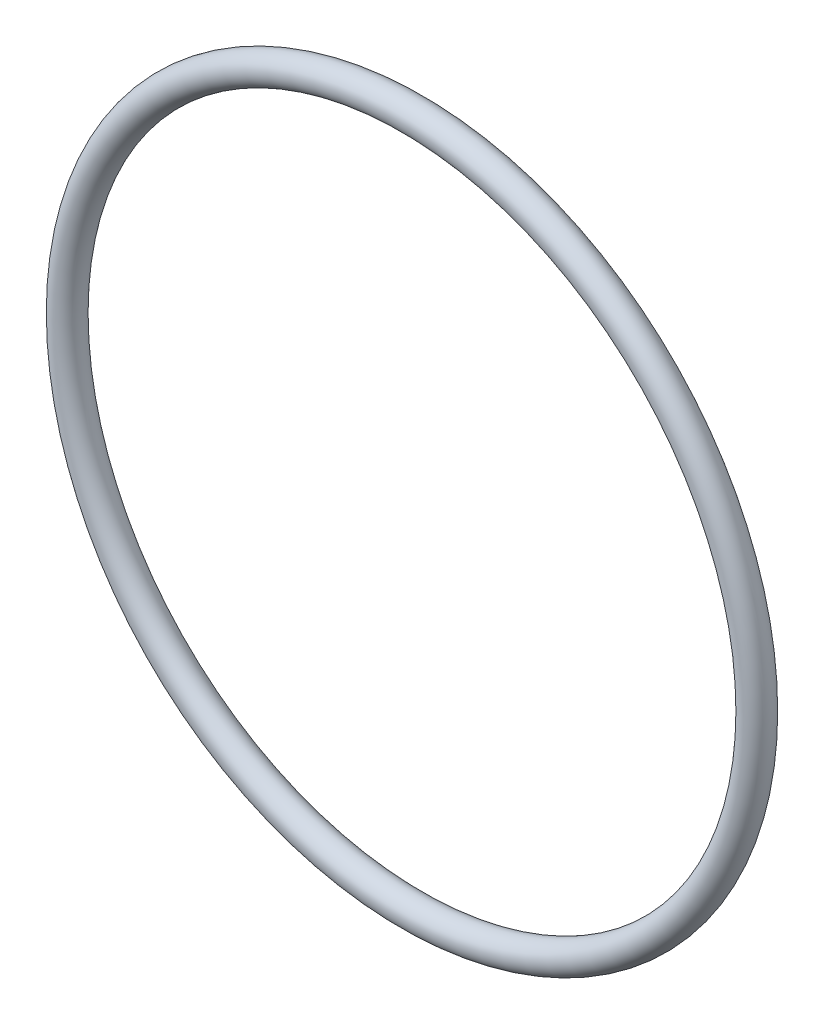
ISO-10303-21;
HEADER;
FILE_DESCRIPTION(('STEP AP214'),'2;1');
FILE_NAME('part.step','',(''),(''),'','','');
FILE_SCHEMA(('AUTOMOTIVE_DESIGN { 1 0 10303 214 1 1 1 1 }'));
ENDSEC;
DATA;
#1=APPLICATION_CONTEXT('core data for automotive mechanical design processes');
#2=APPLICATION_PROTOCOL_DEFINITION('international standard','automotive_design',2000,#1);
#3=PRODUCT_CONTEXT('',#1,'mechanical');
#4=PRODUCT('Part','Part','',(#3));
#5=PRODUCT_RELATED_PRODUCT_CATEGORY('part','',(#4));
#6=PRODUCT_DEFINITION_FORMATION('','',#4);
#7=PRODUCT_DEFINITION_CONTEXT('part definition',#1,'design');
#8=PRODUCT_DEFINITION('design','',#6,#7);
#9=PRODUCT_DEFINITION_SHAPE('','',#8);
#10=(LENGTH_UNIT() NAMED_UNIT(*) SI_UNIT(.MILLI.,.METRE.));
#11=(NAMED_UNIT(*) PLANE_ANGLE_UNIT() SI_UNIT($,.RADIAN.));
#12=(NAMED_UNIT(*) SI_UNIT($,.STERADIAN.) SOLID_ANGLE_UNIT());
#13=UNCERTAINTY_MEASURE_WITH_UNIT(LENGTH_MEASURE(1.E-05),#10,'distance_accuracy_value','');
#14=(GEOMETRIC_REPRESENTATION_CONTEXT(3) GLOBAL_UNCERTAINTY_ASSIGNED_CONTEXT((#13)) GLOBAL_UNIT_ASSIGNED_CONTEXT((#10,
#11,#12)) REPRESENTATION_CONTEXT('',''));
#15=CARTESIAN_POINT('',(0.,0.,0.));
#16=DIRECTION('',(0.,0.,1.));
#17=DIRECTION('',(1.,0.,0.));
#18=AXIS2_PLACEMENT_3D('',#15,#16,#17);
#19=CARTESIAN_POINT('',(0.,0.,0.));
#20=DIRECTION('',(0.,0.,1.));
#21=DIRECTION('',(1.,0.,0.));
#22=AXIS2_PLACEMENT_3D('',#19,#20,#21);
#23=TOROIDAL_SURFACE('',#22,30.5181,1.3081);
#24=CARTESIAN_POINT('',(31.8262,0.,0.));
#25=VERTEX_POINT('',#24);
#26=VERTEX_LOOP('',#25);
#27=FACE_BOUND('',#26,.T.);
#28=ADVANCED_FACE('F30',(#27),#23,.T.);
#29=CLOSED_SHELL('',(#28));
#30=MANIFOLD_SOLID_BREP('B2',#29);
#31=ADVANCED_BREP_SHAPE_REPRESENTATION('',(#18,#30),#14);
#32=SHAPE_DEFINITION_REPRESENTATION(#9,#31);
ENDSEC;
END-ISO-10303-21;
